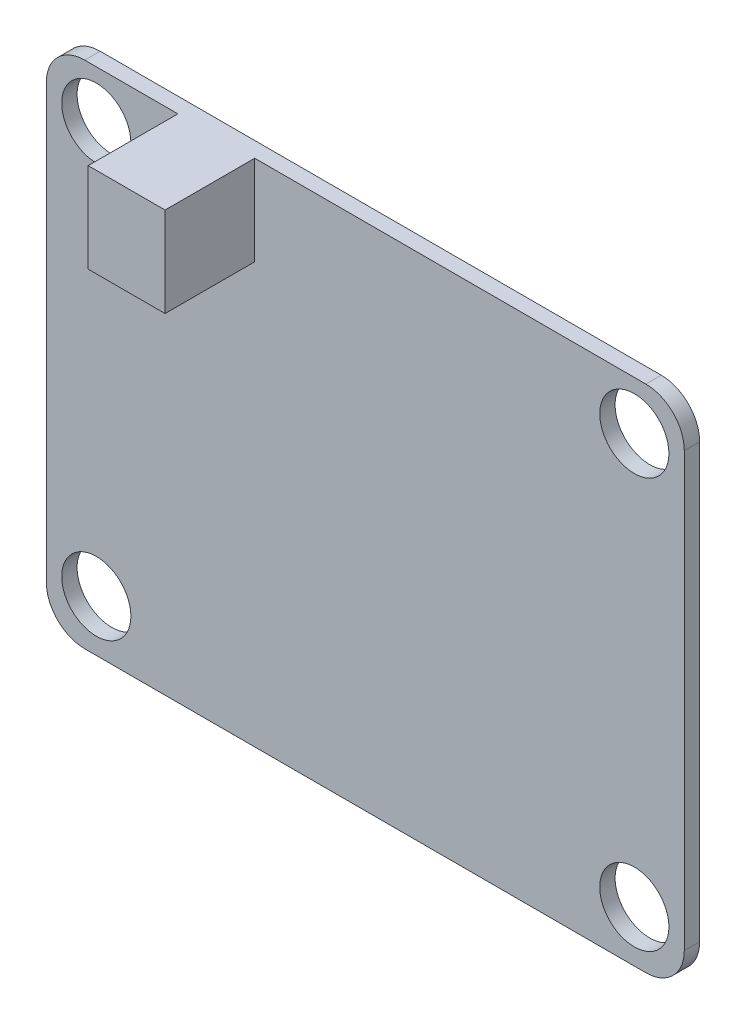
ISO-10303-21;
HEADER;
FILE_DESCRIPTION(('STEP AP214'),'2;1');
FILE_NAME('part.step','',(''),(''),'','','');
FILE_SCHEMA(('AUTOMOTIVE_DESIGN { 1 0 10303 214 1 1 1 1 }'));
ENDSEC;
DATA;
#1=APPLICATION_CONTEXT('core data for automotive mechanical design processes');
#2=APPLICATION_PROTOCOL_DEFINITION('international standard','automotive_design',2000,#1);
#3=PRODUCT_CONTEXT('',#1,'mechanical');
#4=PRODUCT('Part','Part','',(#3));
#5=PRODUCT_RELATED_PRODUCT_CATEGORY('part','',(#4));
#6=PRODUCT_DEFINITION_FORMATION('','',#4);
#7=PRODUCT_DEFINITION_CONTEXT('part definition',#1,'design');
#8=PRODUCT_DEFINITION('design','',#6,#7);
#9=PRODUCT_DEFINITION_SHAPE('','',#8);
#10=(LENGTH_UNIT() NAMED_UNIT(*) SI_UNIT(.MILLI.,.METRE.));
#11=(NAMED_UNIT(*) PLANE_ANGLE_UNIT() SI_UNIT($,.RADIAN.));
#12=(NAMED_UNIT(*) SI_UNIT($,.STERADIAN.) SOLID_ANGLE_UNIT());
#13=UNCERTAINTY_MEASURE_WITH_UNIT(LENGTH_MEASURE(1.E-05),#10,'distance_accuracy_value','');
#14=(GEOMETRIC_REPRESENTATION_CONTEXT(3) GLOBAL_UNCERTAINTY_ASSIGNED_CONTEXT((#13)) GLOBAL_UNIT_ASSIGNED_CONTEXT((#10,
#11,#12)) REPRESENTATION_CONTEXT('',''));
#15=CARTESIAN_POINT('',(0.,0.,0.));
#16=DIRECTION('',(0.,0.,1.));
#17=DIRECTION('',(1.,0.,0.));
#18=AXIS2_PLACEMENT_3D('',#15,#16,#17);
#19=CARTESIAN_POINT('',(0.,0.,1.2));
#20=DIRECTION('',(0.,0.,1.));
#21=DIRECTION('',(1.,0.,0.));
#22=AXIS2_PLACEMENT_3D('',#19,#20,#21);
#23=PLANE('',#22);
#24=DIRECTION('',(0.,1.,0.));
#25=VECTOR('',#24,1.);
#26=CARTESIAN_POINT('',(-40.5955645276779,16.1420689655172,1.2));
#27=LINE('',#26,#25);
#28=CARTESIAN_POINT('',(-40.5955645276779,9.14206896551724,1.2));
#29=VERTEX_POINT('',#28);
#30=CARTESIAN_POINT('',(-40.5955645276779,16.1420689655172,1.2));
#31=VERTEX_POINT('',#30);
#32=EDGE_CURVE('E48',#29,#31,#27,.T.);
#33=ORIENTED_EDGE('',*,*,#32,.F.);
#34=DIRECTION('',(1.,0.,0.));
#35=VECTOR('',#34,1.);
#36=CARTESIAN_POINT('',(-40.5955645276779,9.14206896551724,1.2));
#37=LINE('',#36,#35);
#38=CARTESIAN_POINT('',(-46.5955645276779,9.14206896551724,1.2));
#39=VERTEX_POINT('',#38);
#40=EDGE_CURVE('E140',#39,#29,#37,.T.);
#41=ORIENTED_EDGE('',*,*,#40,.F.);
#42=DIRECTION('',(0.,-1.,0.));
#43=VECTOR('',#42,1.);
#44=CARTESIAN_POINT('',(-46.5955645276779,16.1420689655172,1.2));
#45=LINE('',#44,#43);
#46=CARTESIAN_POINT('',(-46.5955645276779,16.1420689655172,1.2));
#47=VERTEX_POINT('',#46);
#48=EDGE_CURVE('E54',#47,#39,#45,.T.);
#49=ORIENTED_EDGE('',*,*,#48,.F.);
#50=DIRECTION('',(-1.,0.,0.));
#51=VECTOR('',#50,1.);
#52=CARTESIAN_POINT('',(-56.8634123719052,16.1420689655172,1.2));
#53=LINE('',#52,#51);
#54=CARTESIAN_POINT('',(-53.8634123719052,16.1420689655172,1.2));
#55=VERTEX_POINT('',#54);
#56=EDGE_CURVE('E183',#47,#55,#53,.T.);
#57=ORIENTED_EDGE('',*,*,#56,.T.);
#58=CARTESIAN_POINT('',(-53.8634123719052,13.1420689655172,1.2));
#59=DIRECTION('',(0.,0.,1.));
#60=DIRECTION('',(1.,0.,0.));
#61=AXIS2_PLACEMENT_3D('',#58,#59,#60);
#62=CIRCLE('',#61,3.);
#63=CARTESIAN_POINT('',(-56.8634123719052,13.1420689655172,1.2));
#64=VERTEX_POINT('',#63);
#65=EDGE_CURVE('E219',#55,#64,#62,.T.);
#66=ORIENTED_EDGE('',*,*,#65,.T.);
#67=DIRECTION('',(0.,-1.,0.));
#68=VECTOR('',#67,1.);
#69=CARTESIAN_POINT('',(-56.8634123719052,16.1420689655172,1.2));
#70=LINE('',#69,#68);
#71=CARTESIAN_POINT('',(-56.8634123719052,-20.6579310344827,1.2));
#72=VERTEX_POINT('',#71);
#73=EDGE_CURVE('E173',#64,#72,#70,.T.);
#74=ORIENTED_EDGE('',*,*,#73,.T.);
#75=CARTESIAN_POINT('',(-53.8634123719051,-20.6579310344828,1.2));
#76=DIRECTION('',(0.,0.,1.));
#77=DIRECTION('',(1.,0.,0.));
#78=AXIS2_PLACEMENT_3D('',#75,#76,#77);
#79=CIRCLE('',#78,3.);
#80=CARTESIAN_POINT('',(-53.8634123719051,-23.6579310344828,1.2));
#81=VERTEX_POINT('',#80);
#82=EDGE_CURVE('E215',#72,#81,#79,.T.);
#83=ORIENTED_EDGE('',*,*,#82,.T.);
#84=DIRECTION('',(1.,0.,0.));
#85=VECTOR('',#84,1.);
#86=CARTESIAN_POINT('',(-56.8634123719052,-23.6579310344828,1.2));
#87=LINE('',#86,#85);
#88=CARTESIAN_POINT('',(-10.0634123719052,-23.6579310344828,1.2));
#89=VERTEX_POINT('',#88);
#90=EDGE_CURVE('E176',#81,#89,#87,.T.);
#91=ORIENTED_EDGE('',*,*,#90,.T.);
#92=CARTESIAN_POINT('',(-10.0634123719052,-20.6579310344828,1.2));
#93=DIRECTION('',(0.,0.,1.));
#94=DIRECTION('',(1.,0.,0.));
#95=AXIS2_PLACEMENT_3D('',#92,#93,#94);
#96=CIRCLE('',#95,3.);
#97=CARTESIAN_POINT('',(-7.06341237190516,-20.6579310344827,1.2));
#98=VERTEX_POINT('',#97);
#99=EDGE_CURVE('E217',#89,#98,#96,.T.);
#100=ORIENTED_EDGE('',*,*,#99,.T.);
#101=DIRECTION('',(0.,1.,0.));
#102=VECTOR('',#101,1.);
#103=CARTESIAN_POINT('',(-7.06341237190517,16.1420689655172,1.2));
#104=LINE('',#103,#102);
#105=CARTESIAN_POINT('',(-7.06341237190517,13.1420689655172,1.2));
#106=VERTEX_POINT('',#105);
#107=EDGE_CURVE('E180',#98,#106,#104,.T.);
#108=ORIENTED_EDGE('',*,*,#107,.T.);
#109=CARTESIAN_POINT('',(-10.0634123719052,13.1420689655172,1.2));
#110=DIRECTION('',(0.,0.,1.));
#111=DIRECTION('',(1.,0.,0.));
#112=AXIS2_PLACEMENT_3D('',#109,#110,#111);
#113=CIRCLE('',#112,3.);
#114=CARTESIAN_POINT('',(-10.0634123719052,16.1420689655172,1.2));
#115=VERTEX_POINT('',#114);
#116=EDGE_CURVE('E221',#106,#115,#113,.T.);
#117=ORIENTED_EDGE('',*,*,#116,.T.);
#118=EDGE_CURVE('E184',#115,#31,#53,.T.);
#119=ORIENTED_EDGE('',*,*,#118,.T.);
#120=EDGE_LOOP('',(#33,#41,#49,#57,#66,#74,#83,#91,#100,#108,#117,#119));
#121=FACE_BOUND('',#120,.T.);
#122=CARTESIAN_POINT('',(-10.9634123719048,-19.6579310344828,1.2));
#123=DIRECTION('',(0.,0.,1.));
#124=DIRECTION('',(1.,0.,0.));
#125=AXIS2_PLACEMENT_3D('',#122,#123,#124);
#126=CIRCLE('',#125,2.7);
#127=CARTESIAN_POINT('',(-8.26341237190482,-19.6579310344828,1.2));
#128=VERTEX_POINT('',#127);
#129=EDGE_CURVE('E155',#128,#128,#126,.T.);
#130=ORIENTED_EDGE('',*,*,#129,.F.);
#131=EDGE_LOOP('',(#130));
#132=FACE_BOUND('',#131,.T.);
#133=CARTESIAN_POINT('',(-52.9634123719052,12.3420689655172,1.2));
#134=DIRECTION('',(0.,0.,1.));
#135=DIRECTION('',(1.,0.,0.));
#136=AXIS2_PLACEMENT_3D('',#133,#134,#135);
#137=CIRCLE('',#136,2.7);
#138=CARTESIAN_POINT('',(-50.2634123719052,12.3420689655172,1.2));
#139=VERTEX_POINT('',#138);
#140=EDGE_CURVE('E167',#139,#139,#137,.T.);
#141=ORIENTED_EDGE('',*,*,#140,.F.);
#142=EDGE_LOOP('',(#141));
#143=FACE_BOUND('',#142,.T.);
#144=CARTESIAN_POINT('',(-10.9634123719052,12.3420689655172,1.2));
#145=DIRECTION('',(0.,0.,1.));
#146=DIRECTION('',(1.,0.,0.));
#147=AXIS2_PLACEMENT_3D('',#144,#145,#146);
#148=CIRCLE('',#147,2.7);
#149=CARTESIAN_POINT('',(-8.26341237190516,12.3420689655172,1.2));
#150=VERTEX_POINT('',#149);
#151=EDGE_CURVE('E161',#150,#150,#148,.T.);
#152=ORIENTED_EDGE('',*,*,#151,.F.);
#153=EDGE_LOOP('',(#152));
#154=FACE_BOUND('',#153,.T.);
#155=CARTESIAN_POINT('',(-52.9634123719048,-19.6579310344828,1.2));
#156=DIRECTION('',(0.,0.,1.));
#157=DIRECTION('',(1.,0.,0.));
#158=AXIS2_PLACEMENT_3D('',#155,#156,#157);
#159=CIRCLE('',#158,2.7);
#160=CARTESIAN_POINT('',(-50.2634123719048,-19.6579310344828,1.2));
#161=VERTEX_POINT('',#160);
#162=EDGE_CURVE('E146',#161,#161,#159,.T.);
#163=ORIENTED_EDGE('',*,*,#162,.F.);
#164=EDGE_LOOP('',(#163));
#165=FACE_BOUND('',#164,.T.);
#166=ADVANCED_FACE('F33',(#121,#132,#143,#154,#165),#23,.T.);
#167=CARTESIAN_POINT('',(0.,0.,0.));
#168=DIRECTION('',(0.,0.,1.));
#169=DIRECTION('',(1.,0.,0.));
#170=AXIS2_PLACEMENT_3D('',#167,#168,#169);
#171=PLANE('',#170);
#172=DIRECTION('',(-1.,0.,0.));
#173=VECTOR('',#172,1.);
#174=CARTESIAN_POINT('',(-56.8634123719052,16.1420689655172,0.));
#175=LINE('',#174,#173);
#176=CARTESIAN_POINT('',(-10.0634123719052,16.1420689655172,0.));
#177=VERTEX_POINT('',#176);
#178=CARTESIAN_POINT('',(-53.8634123719052,16.1420689655172,0.));
#179=VERTEX_POINT('',#178);
#180=EDGE_CURVE('E177',#177,#179,#175,.T.);
#181=ORIENTED_EDGE('',*,*,#180,.F.);
#182=CARTESIAN_POINT('',(-10.0634123719052,13.1420689655172,0.));
#183=DIRECTION('',(0.,0.,1.));
#184=DIRECTION('',(1.,0.,0.));
#185=AXIS2_PLACEMENT_3D('',#182,#183,#184);
#186=CIRCLE('',#185,3.);
#187=CARTESIAN_POINT('',(-7.06341237190517,13.1420689655172,0.));
#188=VERTEX_POINT('',#187);
#189=EDGE_CURVE('E208',#177,#188,#186,.F.);
#190=ORIENTED_EDGE('',*,*,#189,.T.);
#191=DIRECTION('',(0.,1.,0.));
#192=VECTOR('',#191,1.);
#193=CARTESIAN_POINT('',(-7.06341237190517,16.1420689655172,0.));
#194=LINE('',#193,#192);
#195=CARTESIAN_POINT('',(-7.06341237190516,-20.6579310344827,0.));
#196=VERTEX_POINT('',#195);
#197=EDGE_CURVE('E192',#196,#188,#194,.T.);
#198=ORIENTED_EDGE('',*,*,#197,.F.);
#199=CARTESIAN_POINT('',(-10.0634123719052,-20.6579310344828,0.));
#200=DIRECTION('',(0.,0.,1.));
#201=DIRECTION('',(1.,0.,0.));
#202=AXIS2_PLACEMENT_3D('',#199,#200,#201);
#203=CIRCLE('',#202,3.);
#204=CARTESIAN_POINT('',(-10.0634123719052,-23.6579310344828,0.));
#205=VERTEX_POINT('',#204);
#206=EDGE_CURVE('E204',#196,#205,#203,.F.);
#207=ORIENTED_EDGE('',*,*,#206,.T.);
#208=DIRECTION('',(1.,0.,0.));
#209=VECTOR('',#208,1.);
#210=CARTESIAN_POINT('',(-56.8634123719052,-23.6579310344828,0.));
#211=LINE('',#210,#209);
#212=CARTESIAN_POINT('',(-53.8634123719051,-23.6579310344828,0.));
#213=VERTEX_POINT('',#212);
#214=EDGE_CURVE('E189',#213,#205,#211,.T.);
#215=ORIENTED_EDGE('',*,*,#214,.F.);
#216=CARTESIAN_POINT('',(-53.8634123719051,-20.6579310344828,0.));
#217=DIRECTION('',(0.,0.,1.));
#218=DIRECTION('',(1.,0.,0.));
#219=AXIS2_PLACEMENT_3D('',#216,#217,#218);
#220=CIRCLE('',#219,3.);
#221=CARTESIAN_POINT('',(-56.8634123719052,-20.6579310344827,0.));
#222=VERTEX_POINT('',#221);
#223=EDGE_CURVE('E202',#213,#222,#220,.F.);
#224=ORIENTED_EDGE('',*,*,#223,.T.);
#225=DIRECTION('',(0.,-1.,0.));
#226=VECTOR('',#225,1.);
#227=CARTESIAN_POINT('',(-56.8634123719052,16.1420689655172,0.));
#228=LINE('',#227,#226);
#229=CARTESIAN_POINT('',(-56.8634123719052,13.1420689655172,0.));
#230=VERTEX_POINT('',#229);
#231=EDGE_CURVE('E170',#230,#222,#228,.T.);
#232=ORIENTED_EDGE('',*,*,#231,.F.);
#233=CARTESIAN_POINT('',(-53.8634123719052,13.1420689655172,0.));
#234=DIRECTION('',(0.,0.,1.));
#235=DIRECTION('',(1.,0.,0.));
#236=AXIS2_PLACEMENT_3D('',#233,#234,#235);
#237=CIRCLE('',#236,3.);
#238=EDGE_CURVE('E206',#230,#179,#237,.F.);
#239=ORIENTED_EDGE('',*,*,#238,.T.);
#240=EDGE_LOOP('',(#181,#190,#198,#207,#215,#224,#232,#239));
#241=FACE_BOUND('',#240,.T.);
#242=CARTESIAN_POINT('',(-52.9634123719052,12.3420689655172,0.));
#243=DIRECTION('',(0.,0.,1.));
#244=DIRECTION('',(1.,0.,0.));
#245=AXIS2_PLACEMENT_3D('',#242,#243,#244);
#246=CIRCLE('',#245,2.7);
#247=CARTESIAN_POINT('',(-50.2634123719052,12.3420689655172,0.));
#248=VERTEX_POINT('',#247);
#249=EDGE_CURVE('E164',#248,#248,#246,.T.);
#250=ORIENTED_EDGE('',*,*,#249,.T.);
#251=EDGE_LOOP('',(#250));
#252=FACE_BOUND('',#251,.T.);
#253=CARTESIAN_POINT('',(-10.9634123719052,12.3420689655172,0.));
#254=DIRECTION('',(0.,0.,1.));
#255=DIRECTION('',(1.,0.,0.));
#256=AXIS2_PLACEMENT_3D('',#253,#254,#255);
#257=CIRCLE('',#256,2.7);
#258=CARTESIAN_POINT('',(-8.26341237190516,12.3420689655172,0.));
#259=VERTEX_POINT('',#258);
#260=EDGE_CURVE('E158',#259,#259,#257,.T.);
#261=ORIENTED_EDGE('',*,*,#260,.T.);
#262=EDGE_LOOP('',(#261));
#263=FACE_BOUND('',#262,.T.);
#264=CARTESIAN_POINT('',(-10.9634123719048,-19.6579310344828,0.));
#265=DIRECTION('',(0.,0.,1.));
#266=DIRECTION('',(1.,0.,0.));
#267=AXIS2_PLACEMENT_3D('',#264,#265,#266);
#268=CIRCLE('',#267,2.7);
#269=CARTESIAN_POINT('',(-8.26341237190482,-19.6579310344828,0.));
#270=VERTEX_POINT('',#269);
#271=EDGE_CURVE('E153',#270,#270,#268,.T.);
#272=ORIENTED_EDGE('',*,*,#271,.T.);
#273=EDGE_LOOP('',(#272));
#274=FACE_BOUND('',#273,.T.);
#275=CARTESIAN_POINT('',(-52.9634123719048,-19.6579310344828,0.));
#276=DIRECTION('',(0.,0.,1.));
#277=DIRECTION('',(1.,0.,0.));
#278=AXIS2_PLACEMENT_3D('',#275,#276,#277);
#279=CIRCLE('',#278,2.7);
#280=CARTESIAN_POINT('',(-50.2634123719048,-19.6579310344828,0.));
#281=VERTEX_POINT('',#280);
#282=EDGE_CURVE('E143',#281,#281,#279,.T.);
#283=ORIENTED_EDGE('',*,*,#282,.T.);
#284=EDGE_LOOP('',(#283));
#285=FACE_BOUND('',#284,.T.);
#286=ADVANCED_FACE('F238',(#241,#252,#263,#274,#285),#171,.F.);
#287=CARTESIAN_POINT('',(-56.8634123719052,16.1420689655172,1.2));
#288=DIRECTION('',(1.,0.,0.));
#289=DIRECTION('',(0.,1.,0.));
#290=AXIS2_PLACEMENT_3D('',#287,#288,#289);
#291=PLANE('',#290);
#292=ORIENTED_EDGE('',*,*,#73,.F.);
#293=DIRECTION('',(0.,0.,-1.));
#294=VECTOR('',#293,1.);
#295=CARTESIAN_POINT('',(-56.8634123719052,13.1420689655172,1.2));
#296=LINE('',#295,#294);
#297=EDGE_CURVE('E225',#64,#230,#296,.T.);
#298=ORIENTED_EDGE('',*,*,#297,.T.);
#299=ORIENTED_EDGE('',*,*,#231,.T.);
#300=DIRECTION('',(0.,0.,-1.));
#301=VECTOR('',#300,1.);
#302=CARTESIAN_POINT('',(-56.8634123719052,-20.6579310344828,1.2));
#303=LINE('',#302,#301);
#304=EDGE_CURVE('E223',#222,#72,#303,.F.);
#305=ORIENTED_EDGE('',*,*,#304,.T.);
#306=EDGE_LOOP('',(#292,#298,#299,#305));
#307=FACE_BOUND('',#306,.T.);
#308=ADVANCED_FACE('F262',(#307),#291,.F.);
#309=CARTESIAN_POINT('',(-56.8634123719052,-23.6579310344828,1.2));
#310=DIRECTION('',(0.,1.,0.));
#311=DIRECTION('',(0.,0.,1.));
#312=AXIS2_PLACEMENT_3D('',#309,#310,#311);
#313=PLANE('',#312);
#314=ORIENTED_EDGE('',*,*,#214,.T.);
#315=DIRECTION('',(0.,0.,-1.));
#316=VECTOR('',#315,1.);
#317=CARTESIAN_POINT('',(-10.0634123719052,-23.6579310344828,1.2));
#318=LINE('',#317,#316);
#319=EDGE_CURVE('E11',#205,#89,#318,.F.);
#320=ORIENTED_EDGE('',*,*,#319,.T.);
#321=ORIENTED_EDGE('',*,*,#90,.F.);
#322=DIRECTION('',(0.,0.,-1.));
#323=VECTOR('',#322,1.);
#324=CARTESIAN_POINT('',(-53.8634123719051,-23.6579310344828,1.2));
#325=LINE('',#324,#323);
#326=EDGE_CURVE('E41',#81,#213,#325,.T.);
#327=ORIENTED_EDGE('',*,*,#326,.T.);
#328=EDGE_LOOP('',(#314,#320,#321,#327));
#329=FACE_BOUND('',#328,.T.);
#330=ADVANCED_FACE('F232',(#329),#313,.F.);
#331=CARTESIAN_POINT('',(-7.06341237190517,16.1420689655172,1.2));
#332=DIRECTION('',(-1.,0.,0.));
#333=DIRECTION('',(0.,-1.,0.));
#334=AXIS2_PLACEMENT_3D('',#331,#332,#333);
#335=PLANE('',#334);
#336=ORIENTED_EDGE('',*,*,#197,.T.);
#337=DIRECTION('',(0.,0.,-1.));
#338=VECTOR('',#337,1.);
#339=CARTESIAN_POINT('',(-7.06341237190517,13.1420689655172,1.2));
#340=LINE('',#339,#338);
#341=EDGE_CURVE('E213',#188,#106,#340,.F.);
#342=ORIENTED_EDGE('',*,*,#341,.T.);
#343=ORIENTED_EDGE('',*,*,#107,.F.);
#344=DIRECTION('',(0.,0.,-1.));
#345=VECTOR('',#344,1.);
#346=CARTESIAN_POINT('',(-7.06341237190516,-20.6579310344828,1.2));
#347=LINE('',#346,#345);
#348=EDGE_CURVE('E210',#98,#196,#347,.T.);
#349=ORIENTED_EDGE('',*,*,#348,.T.);
#350=EDGE_LOOP('',(#336,#342,#343,#349));
#351=FACE_BOUND('',#350,.T.);
#352=ADVANCED_FACE('F248',(#351),#335,.F.);
#353=CARTESIAN_POINT('',(-56.8634123719052,16.1420689655172,1.2));
#354=DIRECTION('',(0.,-1.,0.));
#355=DIRECTION('',(0.,0.,-1.));
#356=AXIS2_PLACEMENT_3D('',#353,#354,#355);
#357=PLANE('',#356);
#358=ORIENTED_EDGE('',*,*,#118,.F.);
#359=DIRECTION('',(0.,0.,-1.));
#360=VECTOR('',#359,1.);
#361=CARTESIAN_POINT('',(-10.0634123719052,16.1420689655172,1.2));
#362=LINE('',#361,#360);
#363=EDGE_CURVE('E199',#115,#177,#362,.T.);
#364=ORIENTED_EDGE('',*,*,#363,.T.);
#365=ORIENTED_EDGE('',*,*,#180,.T.);
#366=DIRECTION('',(0.,0.,-1.));
#367=VECTOR('',#366,1.);
#368=CARTESIAN_POINT('',(-53.8634123719052,16.1420689655172,1.2));
#369=LINE('',#368,#367);
#370=EDGE_CURVE('E186',#179,#55,#369,.F.);
#371=ORIENTED_EDGE('',*,*,#370,.T.);
#372=ORIENTED_EDGE('',*,*,#56,.F.);
#373=DIRECTION('',(0.,0.,-1.));
#374=VECTOR('',#373,1.);
#375=CARTESIAN_POINT('',(-46.5955645276779,16.1420689655172,8.2));
#376=LINE('',#375,#374);
#377=CARTESIAN_POINT('',(-46.5955645276779,16.1420689655172,8.2));
#378=VERTEX_POINT('',#377);
#379=EDGE_CURVE('E127',#378,#47,#376,.T.);
#380=ORIENTED_EDGE('',*,*,#379,.F.);
#381=DIRECTION('',(-1.,0.,0.));
#382=VECTOR('',#381,1.);
#383=CARTESIAN_POINT('',(-40.5955645276779,16.1420689655172,8.2));
#384=LINE('',#383,#382);
#385=CARTESIAN_POINT('',(-40.5955645276779,16.1420689655172,8.2));
#386=VERTEX_POINT('',#385);
#387=EDGE_CURVE('E120',#386,#378,#384,.T.);
#388=ORIENTED_EDGE('',*,*,#387,.F.);
#389=DIRECTION('',(0.,0.,-1.));
#390=VECTOR('',#389,1.);
#391=CARTESIAN_POINT('',(-40.5955645276779,16.1420689655172,8.2));
#392=LINE('',#391,#390);
#393=EDGE_CURVE('E125',#386,#31,#392,.T.);
#394=ORIENTED_EDGE('',*,*,#393,.T.);
#395=EDGE_LOOP('',(#358,#364,#365,#371,#372,#380,#388,#394));
#396=FACE_BOUND('',#395,.T.);
#397=ADVANCED_FACE('F123',(#396),#357,.F.);
#398=CARTESIAN_POINT('',(-52.9634123719052,12.3420689655172,1.2));
#399=DIRECTION('',(0.,0.,-1.));
#400=DIRECTION('',(-1.,0.,0.));
#401=AXIS2_PLACEMENT_3D('',#398,#399,#400);
#402=CYLINDRICAL_SURFACE('',#401,2.7);
#403=ORIENTED_EDGE('',*,*,#140,.T.);
#404=EDGE_LOOP('',(#403));
#405=FACE_BOUND('',#404,.T.);
#406=ORIENTED_EDGE('',*,*,#249,.F.);
#407=EDGE_LOOP('',(#406));
#408=FACE_BOUND('',#407,.T.);
#409=ADVANCED_FACE('F278',(#405,#408),#402,.F.);
#410=CARTESIAN_POINT('',(-10.9634123719052,12.3420689655172,1.2));
#411=DIRECTION('',(0.,0.,-1.));
#412=DIRECTION('',(-1.,0.,0.));
#413=AXIS2_PLACEMENT_3D('',#410,#411,#412);
#414=CYLINDRICAL_SURFACE('',#413,2.7);
#415=ORIENTED_EDGE('',*,*,#151,.T.);
#416=EDGE_LOOP('',(#415));
#417=FACE_BOUND('',#416,.T.);
#418=ORIENTED_EDGE('',*,*,#260,.F.);
#419=EDGE_LOOP('',(#418));
#420=FACE_BOUND('',#419,.T.);
#421=ADVANCED_FACE('F361',(#417,#420),#414,.F.);
#422=CARTESIAN_POINT('',(-10.9634123719048,-19.6579310344828,1.2));
#423=DIRECTION('',(0.,0.,-1.));
#424=DIRECTION('',(-1.,0.,0.));
#425=AXIS2_PLACEMENT_3D('',#422,#423,#424);
#426=CYLINDRICAL_SURFACE('',#425,2.7);
#427=ORIENTED_EDGE('',*,*,#129,.T.);
#428=EDGE_LOOP('',(#427));
#429=FACE_BOUND('',#428,.T.);
#430=ORIENTED_EDGE('',*,*,#271,.F.);
#431=EDGE_LOOP('',(#430));
#432=FACE_BOUND('',#431,.T.);
#433=ADVANCED_FACE('F358',(#429,#432),#426,.F.);
#434=CARTESIAN_POINT('',(-52.9634123719048,-19.6579310344828,1.2));
#435=DIRECTION('',(0.,0.,-1.));
#436=DIRECTION('',(-1.,0.,0.));
#437=AXIS2_PLACEMENT_3D('',#434,#435,#436);
#438=CYLINDRICAL_SURFACE('',#437,2.7);
#439=ORIENTED_EDGE('',*,*,#162,.T.);
#440=EDGE_LOOP('',(#439));
#441=FACE_BOUND('',#440,.T.);
#442=ORIENTED_EDGE('',*,*,#282,.F.);
#443=EDGE_LOOP('',(#442));
#444=FACE_BOUND('',#443,.T.);
#445=ADVANCED_FACE('F291',(#441,#444),#438,.F.);
#446=CARTESIAN_POINT('',(-10.0634123719052,13.1420689655172,1.2));
#447=DIRECTION('',(0.,0.,-1.));
#448=DIRECTION('',(-1.,0.,0.));
#449=AXIS2_PLACEMENT_3D('',#446,#447,#448);
#450=CYLINDRICAL_SURFACE('',#449,3.);
#451=ORIENTED_EDGE('',*,*,#116,.F.);
#452=ORIENTED_EDGE('',*,*,#341,.F.);
#453=ORIENTED_EDGE('',*,*,#189,.F.);
#454=ORIENTED_EDGE('',*,*,#363,.F.);
#455=EDGE_LOOP('',(#451,#452,#453,#454));
#456=FACE_BOUND('',#455,.T.);
#457=ADVANCED_FACE('F254',(#456),#450,.T.);
#458=CARTESIAN_POINT('',(-53.8634123719052,13.1420689655172,1.2));
#459=DIRECTION('',(0.,0.,-1.));
#460=DIRECTION('',(-1.,0.,0.));
#461=AXIS2_PLACEMENT_3D('',#458,#459,#460);
#462=CYLINDRICAL_SURFACE('',#461,3.);
#463=ORIENTED_EDGE('',*,*,#65,.F.);
#464=ORIENTED_EDGE('',*,*,#370,.F.);
#465=ORIENTED_EDGE('',*,*,#238,.F.);
#466=ORIENTED_EDGE('',*,*,#297,.F.);
#467=EDGE_LOOP('',(#463,#464,#465,#466));
#468=FACE_BOUND('',#467,.T.);
#469=ADVANCED_FACE('F259',(#468),#462,.T.);
#470=CARTESIAN_POINT('',(-10.0634123719052,-20.6579310344828,1.2));
#471=DIRECTION('',(0.,0.,-1.));
#472=DIRECTION('',(-1.,0.,0.));
#473=AXIS2_PLACEMENT_3D('',#470,#471,#472);
#474=CYLINDRICAL_SURFACE('',#473,3.);
#475=ORIENTED_EDGE('',*,*,#99,.F.);
#476=ORIENTED_EDGE('',*,*,#319,.F.);
#477=ORIENTED_EDGE('',*,*,#206,.F.);
#478=ORIENTED_EDGE('',*,*,#348,.F.);
#479=EDGE_LOOP('',(#475,#476,#477,#478));
#480=FACE_BOUND('',#479,.T.);
#481=ADVANCED_FACE('F245',(#480),#474,.T.);
#482=CARTESIAN_POINT('',(-53.8634123719051,-20.6579310344828,1.2));
#483=DIRECTION('',(0.,0.,-1.));
#484=DIRECTION('',(-1.,0.,0.));
#485=AXIS2_PLACEMENT_3D('',#482,#483,#484);
#486=CYLINDRICAL_SURFACE('',#485,3.);
#487=ORIENTED_EDGE('',*,*,#82,.F.);
#488=ORIENTED_EDGE('',*,*,#304,.F.);
#489=ORIENTED_EDGE('',*,*,#223,.F.);
#490=ORIENTED_EDGE('',*,*,#326,.F.);
#491=EDGE_LOOP('',(#487,#488,#489,#490));
#492=FACE_BOUND('',#491,.T.);
#493=ADVANCED_FACE('F35',(#492),#486,.T.);
#494=CARTESIAN_POINT('',(-40.5955645276779,16.1420689655172,8.2));
#495=DIRECTION('',(-1.,0.,0.));
#496=DIRECTION('',(0.,0.,1.));
#497=AXIS2_PLACEMENT_3D('',#494,#495,#496);
#498=PLANE('',#497);
#499=ORIENTED_EDGE('',*,*,#32,.T.);
#500=ORIENTED_EDGE('',*,*,#393,.F.);
#501=DIRECTION('',(0.,1.,0.));
#502=VECTOR('',#501,1.);
#503=CARTESIAN_POINT('',(-40.5955645276779,16.1420689655172,8.2));
#504=LINE('',#503,#502);
#505=CARTESIAN_POINT('',(-40.5955645276779,9.14206896551724,8.2));
#506=VERTEX_POINT('',#505);
#507=EDGE_CURVE('E131',#506,#386,#504,.T.);
#508=ORIENTED_EDGE('',*,*,#507,.F.);
#509=DIRECTION('',(0.,0.,-1.));
#510=VECTOR('',#509,1.);
#511=CARTESIAN_POINT('',(-40.5955645276779,9.14206896551724,8.2));
#512=LINE('',#511,#510);
#513=EDGE_CURVE('E440',#506,#29,#512,.T.);
#514=ORIENTED_EDGE('',*,*,#513,.T.);
#515=EDGE_LOOP('',(#499,#500,#508,#514));
#516=FACE_BOUND('',#515,.T.);
#517=ADVANCED_FACE('F142',(#516),#498,.F.);
#518=CARTESIAN_POINT('',(-46.5955645276779,16.1420689655172,8.2));
#519=DIRECTION('',(1.,0.,0.));
#520=DIRECTION('',(0.,0.,-1.));
#521=AXIS2_PLACEMENT_3D('',#518,#519,#520);
#522=PLANE('',#521);
#523=ORIENTED_EDGE('',*,*,#48,.T.);
#524=DIRECTION('',(0.,0.,-1.));
#525=VECTOR('',#524,1.);
#526=CARTESIAN_POINT('',(-46.5955645276779,9.14206896551724,8.2));
#527=LINE('',#526,#525);
#528=CARTESIAN_POINT('',(-46.5955645276779,9.14206896551724,8.2));
#529=VERTEX_POINT('',#528);
#530=EDGE_CURVE('E148',#529,#39,#527,.T.);
#531=ORIENTED_EDGE('',*,*,#530,.F.);
#532=DIRECTION('',(0.,-1.,0.));
#533=VECTOR('',#532,1.);
#534=CARTESIAN_POINT('',(-46.5955645276779,16.1420689655172,8.2));
#535=LINE('',#534,#533);
#536=EDGE_CURVE('E130',#378,#529,#535,.T.);
#537=ORIENTED_EDGE('',*,*,#536,.F.);
#538=ORIENTED_EDGE('',*,*,#379,.T.);
#539=EDGE_LOOP('',(#523,#531,#537,#538));
#540=FACE_BOUND('',#539,.T.);
#541=ADVANCED_FACE('F269',(#540),#522,.F.);
#542=CARTESIAN_POINT('',(-40.5955645276779,9.14206896551724,8.2));
#543=DIRECTION('',(0.,1.,0.));
#544=DIRECTION('',(-1.,0.,0.));
#545=AXIS2_PLACEMENT_3D('',#542,#543,#544);
#546=PLANE('',#545);
#547=ORIENTED_EDGE('',*,*,#40,.T.);
#548=ORIENTED_EDGE('',*,*,#513,.F.);
#549=DIRECTION('',(1.,0.,0.));
#550=VECTOR('',#549,1.);
#551=CARTESIAN_POINT('',(-40.5955645276779,9.14206896551724,8.2));
#552=LINE('',#551,#550);
#553=EDGE_CURVE('E136',#529,#506,#552,.T.);
#554=ORIENTED_EDGE('',*,*,#553,.F.);
#555=ORIENTED_EDGE('',*,*,#530,.T.);
#556=EDGE_LOOP('',(#547,#548,#554,#555));
#557=FACE_BOUND('',#556,.T.);
#558=ADVANCED_FACE('F334',(#557),#546,.F.);
#559=CARTESIAN_POINT('',(0.,0.,8.2));
#560=DIRECTION('',(0.,0.,-1.));
#561=DIRECTION('',(-1.,0.,0.));
#562=AXIS2_PLACEMENT_3D('',#559,#560,#561);
#563=PLANE('',#562);
#564=ORIENTED_EDGE('',*,*,#507,.T.);
#565=ORIENTED_EDGE('',*,*,#387,.T.);
#566=ORIENTED_EDGE('',*,*,#536,.T.);
#567=ORIENTED_EDGE('',*,*,#553,.T.);
#568=EDGE_LOOP('',(#564,#565,#566,#567));
#569=FACE_BOUND('',#568,.T.);
#570=ADVANCED_FACE('F134',(#569),#563,.F.);
#571=CLOSED_SHELL('',(#166,#286,#308,#330,#352,#397,#409,#421,#433,#445,#457,#469,#481,#493,
#517,#541,#558,#570));
#572=MANIFOLD_SOLID_BREP('B2',#571);
#573=ADVANCED_BREP_SHAPE_REPRESENTATION('',(#18,#572),#14);
#574=SHAPE_DEFINITION_REPRESENTATION(#9,#573);
ENDSEC;
END-ISO-10303-21;
